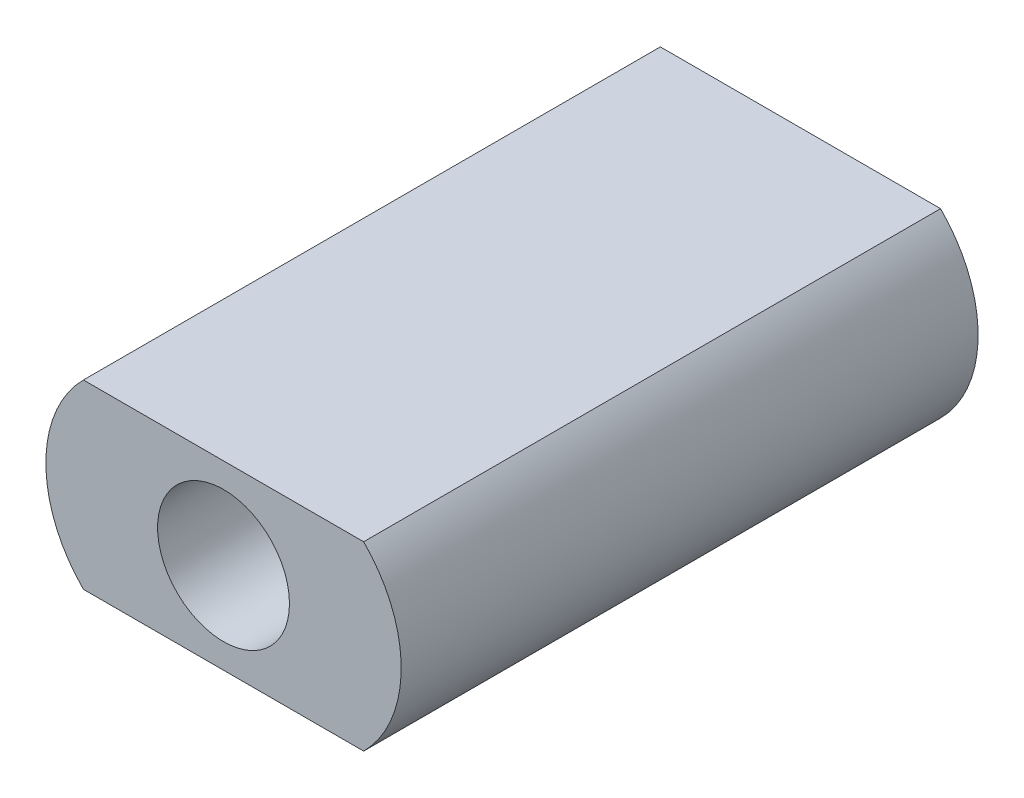
ISO-10303-21;
HEADER;
FILE_DESCRIPTION(('STEP AP214'),'2;1');
FILE_NAME('part.step','',(''),(''),'','','');
FILE_SCHEMA(('AUTOMOTIVE_DESIGN { 1 0 10303 214 1 1 1 1 }'));
ENDSEC;
DATA;
#1=APPLICATION_CONTEXT('core data for automotive mechanical design processes');
#2=APPLICATION_PROTOCOL_DEFINITION('international standard','automotive_design',2000,#1);
#3=PRODUCT_CONTEXT('',#1,'mechanical');
#4=PRODUCT('Part','Part','',(#3));
#5=PRODUCT_RELATED_PRODUCT_CATEGORY('part','',(#4));
#6=PRODUCT_DEFINITION_FORMATION('','',#4);
#7=PRODUCT_DEFINITION_CONTEXT('part definition',#1,'design');
#8=PRODUCT_DEFINITION('design','',#6,#7);
#9=PRODUCT_DEFINITION_SHAPE('','',#8);
#10=(LENGTH_UNIT() NAMED_UNIT(*) SI_UNIT(.MILLI.,.METRE.));
#11=(NAMED_UNIT(*) PLANE_ANGLE_UNIT() SI_UNIT($,.RADIAN.));
#12=(NAMED_UNIT(*) SI_UNIT($,.STERADIAN.) SOLID_ANGLE_UNIT());
#13=UNCERTAINTY_MEASURE_WITH_UNIT(LENGTH_MEASURE(1.E-05),#10,'distance_accuracy_value','');
#14=(GEOMETRIC_REPRESENTATION_CONTEXT(3) GLOBAL_UNCERTAINTY_ASSIGNED_CONTEXT((#13)) GLOBAL_UNIT_ASSIGNED_CONTEXT((#10,
#11,#12)) REPRESENTATION_CONTEXT('',''));
#15=CARTESIAN_POINT('',(0.,0.,0.));
#16=DIRECTION('',(0.,0.,1.));
#17=DIRECTION('',(1.,0.,0.));
#18=AXIS2_PLACEMENT_3D('',#15,#16,#17);
#19=CARTESIAN_POINT('',(-2.99999999999999,0.,17.5));
#20=DIRECTION('',(0.,0.,-1.));
#21=DIRECTION('',(-1.,0.,0.));
#22=AXIS2_PLACEMENT_3D('',#19,#20,#21);
#23=CYLINDRICAL_SURFACE('',#22,7.77817459305203);
#24=CARTESIAN_POINT('',(-2.99999999999999,0.,-17.5));
#25=DIRECTION('',(0.,0.,1.));
#26=DIRECTION('',(1.,0.,0.));
#27=AXIS2_PLACEMENT_3D('',#24,#25,#26);
#28=CIRCLE('',#27,7.77817459305203);
#29=CARTESIAN_POINT('',(-8.5,5.5,-17.5));
#30=VERTEX_POINT('',#29);
#31=CARTESIAN_POINT('',(-8.5,-5.5,-17.5));
#32=VERTEX_POINT('',#31);
#33=EDGE_CURVE('E95',#30,#32,#28,.T.);
#34=ORIENTED_EDGE('',*,*,#33,.T.);
#35=DIRECTION('',(0.,0.,-1.));
#36=VECTOR('',#35,1.);
#37=CARTESIAN_POINT('',(-8.5,-5.5,17.5));
#38=LINE('',#37,#36);
#39=CARTESIAN_POINT('',(-8.5,-5.5,17.5));
#40=VERTEX_POINT('',#39);
#41=EDGE_CURVE('E11',#40,#32,#38,.T.);
#42=ORIENTED_EDGE('',*,*,#41,.F.);
#43=CARTESIAN_POINT('',(-2.99999999999999,0.,17.5));
#44=DIRECTION('',(0.,0.,1.));
#45=DIRECTION('',(1.,0.,0.));
#46=AXIS2_PLACEMENT_3D('',#43,#44,#45);
#47=CIRCLE('',#46,7.77817459305203);
#48=CARTESIAN_POINT('',(-8.5,5.5,17.5));
#49=VERTEX_POINT('',#48);
#50=EDGE_CURVE('E83',#49,#40,#47,.T.);
#51=ORIENTED_EDGE('',*,*,#50,.F.);
#52=DIRECTION('',(0.,0.,-1.));
#53=VECTOR('',#52,1.);
#54=CARTESIAN_POINT('',(-8.5,5.5,17.5));
#55=LINE('',#54,#53);
#56=EDGE_CURVE('E91',#49,#30,#55,.T.);
#57=ORIENTED_EDGE('',*,*,#56,.T.);
#58=EDGE_LOOP('',(#34,#42,#51,#57));
#59=FACE_BOUND('',#58,.T.);
#60=ADVANCED_FACE('F32',(#59),#23,.T.);
#61=CARTESIAN_POINT('',(8.5,-5.5,17.5));
#62=DIRECTION('',(0.,1.,0.));
#63=DIRECTION('',(-1.,0.,0.));
#64=AXIS2_PLACEMENT_3D('',#61,#62,#63);
#65=PLANE('',#64);
#66=DIRECTION('',(1.,0.,0.));
#67=VECTOR('',#66,1.);
#68=CARTESIAN_POINT('',(8.5,-5.5,-17.5));
#69=LINE('',#68,#67);
#70=CARTESIAN_POINT('',(8.5,-5.5,-17.5));
#71=VERTEX_POINT('',#70);
#72=EDGE_CURVE('E87',#32,#71,#69,.T.);
#73=ORIENTED_EDGE('',*,*,#72,.T.);
#74=DIRECTION('',(0.,0.,-1.));
#75=VECTOR('',#74,1.);
#76=CARTESIAN_POINT('',(8.5,-5.5,17.5));
#77=LINE('',#76,#75);
#78=CARTESIAN_POINT('',(8.5,-5.5,17.5));
#79=VERTEX_POINT('',#78);
#80=EDGE_CURVE('E40',#79,#71,#77,.T.);
#81=ORIENTED_EDGE('',*,*,#80,.F.);
#82=DIRECTION('',(1.,0.,0.));
#83=VECTOR('',#82,1.);
#84=CARTESIAN_POINT('',(8.5,-5.5,17.5));
#85=LINE('',#84,#83);
#86=EDGE_CURVE('E78',#40,#79,#85,.T.);
#87=ORIENTED_EDGE('',*,*,#86,.F.);
#88=ORIENTED_EDGE('',*,*,#41,.T.);
#89=EDGE_LOOP('',(#73,#81,#87,#88));
#90=FACE_BOUND('',#89,.T.);
#91=ADVANCED_FACE('F86',(#90),#65,.F.);
#92=CARTESIAN_POINT('',(2.99999999999999,0.,17.5));
#93=DIRECTION('',(0.,0.,-1.));
#94=DIRECTION('',(-1.,0.,0.));
#95=AXIS2_PLACEMENT_3D('',#92,#93,#94);
#96=CYLINDRICAL_SURFACE('',#95,7.77817459305203);
#97=CARTESIAN_POINT('',(2.99999999999999,0.,-17.5));
#98=DIRECTION('',(0.,0.,1.));
#99=DIRECTION('',(-1.,0.,0.));
#100=AXIS2_PLACEMENT_3D('',#97,#98,#99);
#101=CIRCLE('',#100,7.77817459305203);
#102=CARTESIAN_POINT('',(8.5,5.5,-17.5));
#103=VERTEX_POINT('',#102);
#104=EDGE_CURVE('E65',#71,#103,#101,.T.);
#105=ORIENTED_EDGE('',*,*,#104,.T.);
#106=DIRECTION('',(0.,0.,-1.));
#107=VECTOR('',#106,1.);
#108=CARTESIAN_POINT('',(8.5,5.5,17.5));
#109=LINE('',#108,#107);
#110=CARTESIAN_POINT('',(8.5,5.5,17.5));
#111=VERTEX_POINT('',#110);
#112=EDGE_CURVE('E88',#111,#103,#109,.T.);
#113=ORIENTED_EDGE('',*,*,#112,.F.);
#114=CARTESIAN_POINT('',(2.99999999999999,0.,17.5));
#115=DIRECTION('',(0.,0.,1.));
#116=DIRECTION('',(-1.,0.,0.));
#117=AXIS2_PLACEMENT_3D('',#114,#115,#116);
#118=CIRCLE('',#117,7.77817459305203);
#119=EDGE_CURVE('E81',#79,#111,#118,.T.);
#120=ORIENTED_EDGE('',*,*,#119,.F.);
#121=ORIENTED_EDGE('',*,*,#80,.T.);
#122=EDGE_LOOP('',(#105,#113,#120,#121));
#123=FACE_BOUND('',#122,.T.);
#124=ADVANCED_FACE('F89',(#123),#96,.T.);
#125=CARTESIAN_POINT('',(8.5,5.5,17.5));
#126=DIRECTION('',(0.,-1.,0.));
#127=DIRECTION('',(1.,0.,0.));
#128=AXIS2_PLACEMENT_3D('',#125,#126,#127);
#129=PLANE('',#128);
#130=DIRECTION('',(-1.,0.,0.));
#131=VECTOR('',#130,1.);
#132=CARTESIAN_POINT('',(8.5,5.5,-17.5));
#133=LINE('',#132,#131);
#134=EDGE_CURVE('E71',#103,#30,#133,.T.);
#135=ORIENTED_EDGE('',*,*,#134,.T.);
#136=ORIENTED_EDGE('',*,*,#56,.F.);
#137=DIRECTION('',(-1.,0.,0.));
#138=VECTOR('',#137,1.);
#139=CARTESIAN_POINT('',(8.5,5.5,17.5));
#140=LINE('',#139,#138);
#141=EDGE_CURVE('E48',#111,#49,#140,.T.);
#142=ORIENTED_EDGE('',*,*,#141,.F.);
#143=ORIENTED_EDGE('',*,*,#112,.T.);
#144=EDGE_LOOP('',(#135,#136,#142,#143));
#145=FACE_BOUND('',#144,.T.);
#146=ADVANCED_FACE('F103',(#145),#129,.F.);
#147=CARTESIAN_POINT('',(-2.99999999999999,0.,17.5));
#148=DIRECTION('',(0.,0.,1.));
#149=DIRECTION('',(1.,0.,0.));
#150=AXIS2_PLACEMENT_3D('',#147,#148,#149);
#151=PLANE('',#150);
#152=CARTESIAN_POINT('',(0.,0.,17.5));
#153=DIRECTION('',(0.,0.,1.));
#154=DIRECTION('',(1.,0.,0.));
#155=AXIS2_PLACEMENT_3D('',#152,#153,#154);
#156=CIRCLE('',#155,4.);
#157=CARTESIAN_POINT('',(4.,0.,17.5));
#158=VERTEX_POINT('',#157);
#159=EDGE_CURVE('E109',#158,#158,#156,.T.);
#160=ORIENTED_EDGE('',*,*,#159,.F.);
#161=EDGE_LOOP('',(#160));
#162=FACE_BOUND('',#161,.T.);
#163=ORIENTED_EDGE('',*,*,#50,.T.);
#164=ORIENTED_EDGE('',*,*,#86,.T.);
#165=ORIENTED_EDGE('',*,*,#119,.T.);
#166=ORIENTED_EDGE('',*,*,#141,.T.);
#167=EDGE_LOOP('',(#163,#164,#165,#166));
#168=FACE_BOUND('',#167,.T.);
#169=ADVANCED_FACE('F79',(#162,#168),#151,.T.);
#170=CARTESIAN_POINT('',(-2.99999999999999,0.,-17.5));
#171=DIRECTION('',(0.,0.,1.));
#172=DIRECTION('',(1.,0.,0.));
#173=AXIS2_PLACEMENT_3D('',#170,#171,#172);
#174=PLANE('',#173);
#175=ORIENTED_EDGE('',*,*,#33,.F.);
#176=ORIENTED_EDGE('',*,*,#134,.F.);
#177=ORIENTED_EDGE('',*,*,#104,.F.);
#178=ORIENTED_EDGE('',*,*,#72,.F.);
#179=EDGE_LOOP('',(#175,#176,#177,#178));
#180=FACE_BOUND('',#179,.T.);
#181=ADVANCED_FACE('F106',(#180),#174,.F.);
#182=CARTESIAN_POINT('',(0.,0.,-2.5));
#183=DIRECTION('',(0.,0.,1.));
#184=DIRECTION('',(1.,0.,0.));
#185=AXIS2_PLACEMENT_3D('',#182,#183,#184);
#186=CYLINDRICAL_SURFACE('',#185,4.);
#187=CARTESIAN_POINT('',(0.,0.,-2.5));
#188=DIRECTION('',(0.,0.,1.));
#189=DIRECTION('',(1.,0.,0.));
#190=AXIS2_PLACEMENT_3D('',#187,#188,#189);
#191=CIRCLE('',#190,4.);
#192=CARTESIAN_POINT('',(4.,0.,-2.5));
#193=VERTEX_POINT('',#192);
#194=EDGE_CURVE('E98',#193,#193,#191,.T.);
#195=ORIENTED_EDGE('',*,*,#194,.F.);
#196=EDGE_LOOP('',(#195));
#197=FACE_BOUND('',#196,.T.);
#198=ORIENTED_EDGE('',*,*,#159,.T.);
#199=EDGE_LOOP('',(#198));
#200=FACE_BOUND('',#199,.T.);
#201=ADVANCED_FACE('F117',(#197,#200),#186,.F.);
#202=CARTESIAN_POINT('',(0.,0.,-2.5));
#203=DIRECTION('',(0.,0.,1.));
#204=DIRECTION('',(1.,0.,0.));
#205=AXIS2_PLACEMENT_3D('',#202,#203,#204);
#206=PLANE('',#205);
#207=ORIENTED_EDGE('',*,*,#194,.T.);
#208=EDGE_LOOP('',(#207));
#209=FACE_BOUND('',#208,.T.);
#210=ADVANCED_FACE('F115',(#209),#206,.T.);
#211=CLOSED_SHELL('',(#60,#91,#124,#146,#169,#181,#201,#210));
#212=MANIFOLD_SOLID_BREP('B2',#211);
#213=ADVANCED_BREP_SHAPE_REPRESENTATION('',(#18,#212),#14);
#214=SHAPE_DEFINITION_REPRESENTATION(#9,#213);
ENDSEC;
END-ISO-10303-21;
